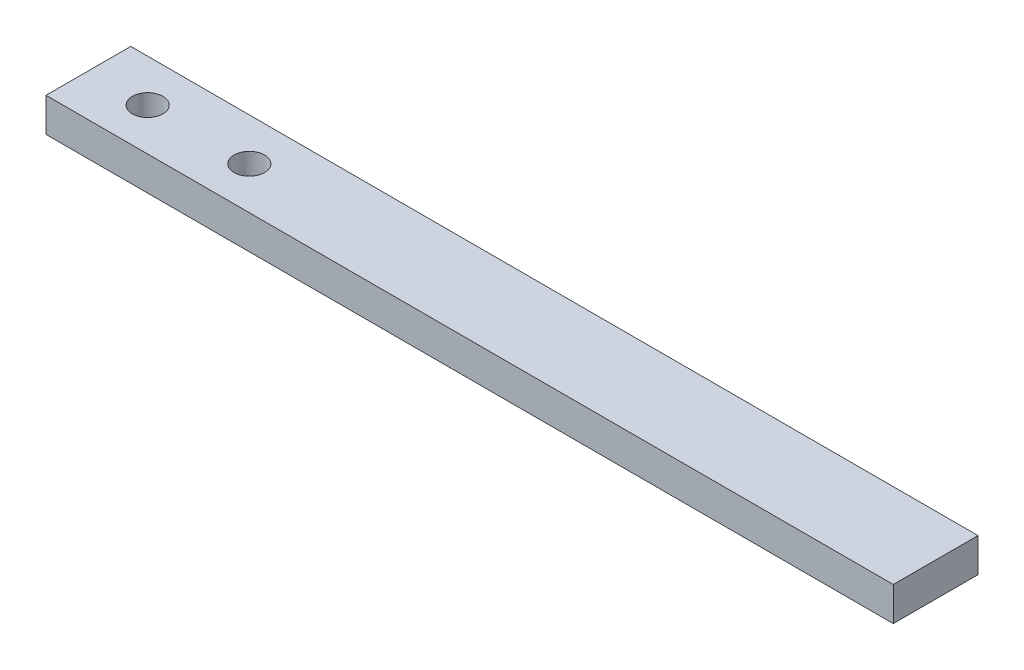
ISO-10303-21;
HEADER;
FILE_DESCRIPTION(('STEP AP214'),'2;1');
FILE_NAME('part.step','',(''),(''),'','','');
FILE_SCHEMA(('AUTOMOTIVE_DESIGN { 1 0 10303 214 1 1 1 1 }'));
ENDSEC;
DATA;
#1=APPLICATION_CONTEXT('core data for automotive mechanical design processes');
#2=APPLICATION_PROTOCOL_DEFINITION('international standard','automotive_design',2000,#1);
#3=PRODUCT_CONTEXT('',#1,'mechanical');
#4=PRODUCT('Part','Part','',(#3));
#5=PRODUCT_RELATED_PRODUCT_CATEGORY('part','',(#4));
#6=PRODUCT_DEFINITION_FORMATION('','',#4);
#7=PRODUCT_DEFINITION_CONTEXT('part definition',#1,'design');
#8=PRODUCT_DEFINITION('design','',#6,#7);
#9=PRODUCT_DEFINITION_SHAPE('','',#8);
#10=(LENGTH_UNIT() NAMED_UNIT(*) SI_UNIT(.MILLI.,.METRE.));
#11=(NAMED_UNIT(*) PLANE_ANGLE_UNIT() SI_UNIT($,.RADIAN.));
#12=(NAMED_UNIT(*) SI_UNIT($,.STERADIAN.) SOLID_ANGLE_UNIT());
#13=UNCERTAINTY_MEASURE_WITH_UNIT(LENGTH_MEASURE(1.E-05),#10,'distance_accuracy_value','');
#14=(GEOMETRIC_REPRESENTATION_CONTEXT(3) GLOBAL_UNCERTAINTY_ASSIGNED_CONTEXT((#13)) GLOBAL_UNIT_ASSIGNED_CONTEXT((#10,
#11,#12)) REPRESENTATION_CONTEXT('',''));
#15=CARTESIAN_POINT('',(0.,0.,0.));
#16=DIRECTION('',(0.,0.,1.));
#17=DIRECTION('',(1.,0.,0.));
#18=AXIS2_PLACEMENT_3D('',#15,#16,#17);
#19=CARTESIAN_POINT('',(-4.18267290292258,2.,-3.44266745497843));
#20=DIRECTION('',(1.,0.,0.));
#21=DIRECTION('',(0.,0.,-1.));
#22=AXIS2_PLACEMENT_3D('',#19,#20,#21);
#23=PLANE('',#22);
#24=DIRECTION('',(0.,0.,1.));
#25=VECTOR('',#24,1.);
#26=CARTESIAN_POINT('',(-4.18267290292258,0.,-3.44266745497843));
#27=LINE('',#26,#25);
#28=CARTESIAN_POINT('',(-4.18267290292258,0.,-3.44266745497843));
#29=VERTEX_POINT('',#28);
#30=CARTESIAN_POINT('',(-4.18267290292258,0.,1.55733254502157));
#31=VERTEX_POINT('',#30);
#32=EDGE_CURVE('E107',#29,#31,#27,.T.);
#33=ORIENTED_EDGE('',*,*,#32,.T.);
#34=DIRECTION('',(0.,-1.,0.));
#35=VECTOR('',#34,1.);
#36=CARTESIAN_POINT('',(-4.18267290292258,2.,1.55733254502157));
#37=LINE('',#36,#35);
#38=CARTESIAN_POINT('',(-4.18267290292258,2.,1.55733254502157));
#39=VERTEX_POINT('',#38);
#40=EDGE_CURVE('E11',#39,#31,#37,.T.);
#41=ORIENTED_EDGE('',*,*,#40,.F.);
#42=DIRECTION('',(0.,0.,1.));
#43=VECTOR('',#42,1.);
#44=CARTESIAN_POINT('',(-4.18267290292258,2.,-3.44266745497843));
#45=LINE('',#44,#43);
#46=CARTESIAN_POINT('',(-4.18267290292258,2.,-3.44266745497843));
#47=VERTEX_POINT('',#46);
#48=EDGE_CURVE('E89',#47,#39,#45,.T.);
#49=ORIENTED_EDGE('',*,*,#48,.F.);
#50=DIRECTION('',(0.,-1.,0.));
#51=VECTOR('',#50,1.);
#52=CARTESIAN_POINT('',(-4.18267290292258,2.,-3.44266745497843));
#53=LINE('',#52,#51);
#54=EDGE_CURVE('E56',#47,#29,#53,.T.);
#55=ORIENTED_EDGE('',*,*,#54,.T.);
#56=EDGE_LOOP('',(#33,#41,#49,#55));
#57=FACE_BOUND('',#56,.T.);
#58=ADVANCED_FACE('F39',(#57),#23,.F.);
#59=CARTESIAN_POINT('',(-4.18267290292258,2.,1.55733254502157));
#60=DIRECTION('',(0.,0.,-1.));
#61=DIRECTION('',(-1.,0.,0.));
#62=AXIS2_PLACEMENT_3D('',#59,#60,#61);
#63=PLANE('',#62);
#64=DIRECTION('',(1.,0.,0.));
#65=VECTOR('',#64,1.);
#66=CARTESIAN_POINT('',(-4.18267290292258,0.,1.55733254502157));
#67=LINE('',#66,#65);
#68=CARTESIAN_POINT('',(45.8173270970774,0.,1.55733254502157));
#69=VERTEX_POINT('',#68);
#70=EDGE_CURVE('E95',#31,#69,#67,.T.);
#71=ORIENTED_EDGE('',*,*,#70,.T.);
#72=DIRECTION('',(0.,-1.,0.));
#73=VECTOR('',#72,1.);
#74=CARTESIAN_POINT('',(45.8173270970774,2.,1.55733254502157));
#75=LINE('',#74,#73);
#76=CARTESIAN_POINT('',(45.8173270970774,2.,1.55733254502157));
#77=VERTEX_POINT('',#76);
#78=EDGE_CURVE('E48',#77,#69,#75,.T.);
#79=ORIENTED_EDGE('',*,*,#78,.F.);
#80=DIRECTION('',(1.,0.,0.));
#81=VECTOR('',#80,1.);
#82=CARTESIAN_POINT('',(-4.18267290292258,2.,1.55733254502157));
#83=LINE('',#82,#81);
#84=EDGE_CURVE('E81',#39,#77,#83,.T.);
#85=ORIENTED_EDGE('',*,*,#84,.F.);
#86=ORIENTED_EDGE('',*,*,#40,.T.);
#87=EDGE_LOOP('',(#71,#79,#85,#86));
#88=FACE_BOUND('',#87,.T.);
#89=ADVANCED_FACE('F94',(#88),#63,.F.);
#90=CARTESIAN_POINT('',(45.8173270970774,2.,-3.44266745497843));
#91=DIRECTION('',(1.,0.,0.));
#92=DIRECTION('',(0.,0.,-1.));
#93=AXIS2_PLACEMENT_3D('',#90,#91,#92);
#94=PLANE('',#93);
#95=DIRECTION('',(0.,0.,1.));
#96=VECTOR('',#95,1.);
#97=CARTESIAN_POINT('',(45.8173270970774,0.,-3.44266745497843));
#98=LINE('',#97,#96);
#99=CARTESIAN_POINT('',(45.8173270970774,0.,-3.44266745497843));
#100=VERTEX_POINT('',#99);
#101=EDGE_CURVE('E113',#100,#69,#98,.T.);
#102=ORIENTED_EDGE('',*,*,#101,.F.);
#103=DIRECTION('',(0.,-1.,0.));
#104=VECTOR('',#103,1.);
#105=CARTESIAN_POINT('',(45.8173270970774,2.,-3.44266745497843));
#106=LINE('',#105,#104);
#107=CARTESIAN_POINT('',(45.8173270970774,2.,-3.44266745497843));
#108=VERTEX_POINT('',#107);
#109=EDGE_CURVE('E70',#108,#100,#106,.T.);
#110=ORIENTED_EDGE('',*,*,#109,.F.);
#111=DIRECTION('',(0.,0.,1.));
#112=VECTOR('',#111,1.);
#113=CARTESIAN_POINT('',(45.8173270970774,2.,-3.44266745497843));
#114=LINE('',#113,#112);
#115=EDGE_CURVE('E88',#108,#77,#114,.T.);
#116=ORIENTED_EDGE('',*,*,#115,.T.);
#117=ORIENTED_EDGE('',*,*,#78,.T.);
#118=EDGE_LOOP('',(#102,#110,#116,#117));
#119=FACE_BOUND('',#118,.T.);
#120=ADVANCED_FACE('F99',(#119),#94,.T.);
#121=CARTESIAN_POINT('',(-4.18267290292258,2.,-3.44266745497843));
#122=DIRECTION('',(0.,0.,-1.));
#123=DIRECTION('',(-1.,0.,0.));
#124=AXIS2_PLACEMENT_3D('',#121,#122,#123);
#125=PLANE('',#124);
#126=DIRECTION('',(1.,0.,0.));
#127=VECTOR('',#126,1.);
#128=CARTESIAN_POINT('',(-4.18267290292258,0.,-3.44266745497843));
#129=LINE('',#128,#127);
#130=EDGE_CURVE('E116',#29,#100,#129,.T.);
#131=ORIENTED_EDGE('',*,*,#130,.F.);
#132=ORIENTED_EDGE('',*,*,#54,.F.);
#133=DIRECTION('',(1.,0.,0.));
#134=VECTOR('',#133,1.);
#135=CARTESIAN_POINT('',(-4.18267290292258,2.,-3.44266745497843));
#136=LINE('',#135,#134);
#137=EDGE_CURVE('E101',#47,#108,#136,.T.);
#138=ORIENTED_EDGE('',*,*,#137,.T.);
#139=ORIENTED_EDGE('',*,*,#109,.T.);
#140=EDGE_LOOP('',(#131,#132,#138,#139));
#141=FACE_BOUND('',#140,.T.);
#142=ADVANCED_FACE('F154',(#141),#125,.T.);
#143=CARTESIAN_POINT('',(0.,2.,0.));
#144=DIRECTION('',(0.,1.,0.));
#145=DIRECTION('',(0.,0.,1.));
#146=AXIS2_PLACEMENT_3D('',#143,#144,#145);
#147=PLANE('',#146);
#148=CARTESIAN_POINT('',(5.31732709707742,2.,-0.942667454978434));
#149=DIRECTION('',(0.,1.,0.));
#150=DIRECTION('',(0.,0.,1.));
#151=AXIS2_PLACEMENT_3D('',#148,#149,#150);
#152=CIRCLE('',#151,0.899999999999999);
#153=CARTESIAN_POINT('',(5.31732709707742,2.,-0.0426674549784347));
#154=VERTEX_POINT('',#153);
#155=EDGE_CURVE('E134',#154,#154,#152,.T.);
#156=ORIENTED_EDGE('',*,*,#155,.F.);
#157=EDGE_LOOP('',(#156));
#158=FACE_BOUND('',#157,.T.);
#159=CARTESIAN_POINT('',(-0.682672902922581,2.,-0.942667454978434));
#160=DIRECTION('',(0.,1.,0.));
#161=DIRECTION('',(0.,0.,1.));
#162=AXIS2_PLACEMENT_3D('',#159,#160,#161);
#163=CIRCLE('',#162,0.9);
#164=CARTESIAN_POINT('',(-0.682672902922581,2.,-0.0426674549784342));
#165=VERTEX_POINT('',#164);
#166=EDGE_CURVE('E126',#165,#165,#163,.T.);
#167=ORIENTED_EDGE('',*,*,#166,.F.);
#168=EDGE_LOOP('',(#167));
#169=FACE_BOUND('',#168,.T.);
#170=ORIENTED_EDGE('',*,*,#48,.T.);
#171=ORIENTED_EDGE('',*,*,#84,.T.);
#172=ORIENTED_EDGE('',*,*,#115,.F.);
#173=ORIENTED_EDGE('',*,*,#137,.F.);
#174=EDGE_LOOP('',(#170,#171,#172,#173));
#175=FACE_BOUND('',#174,.T.);
#176=ADVANCED_FACE('F85',(#158,#169,#175),#147,.T.);
#177=CARTESIAN_POINT('',(0.,0.,0.));
#178=DIRECTION('',(0.,1.,0.));
#179=DIRECTION('',(0.,0.,1.));
#180=AXIS2_PLACEMENT_3D('',#177,#178,#179);
#181=PLANE('',#180);
#182=CARTESIAN_POINT('',(5.31732709707742,0.,-0.942667454978434));
#183=DIRECTION('',(0.,1.,0.));
#184=DIRECTION('',(0.,0.,1.));
#185=AXIS2_PLACEMENT_3D('',#182,#183,#184);
#186=CIRCLE('',#185,0.899999999999999);
#187=CARTESIAN_POINT('',(5.31732709707742,0.,-0.0426674549784347));
#188=VERTEX_POINT('',#187);
#189=EDGE_CURVE('E110',#188,#188,#186,.T.);
#190=ORIENTED_EDGE('',*,*,#189,.T.);
#191=EDGE_LOOP('',(#190));
#192=FACE_BOUND('',#191,.T.);
#193=CARTESIAN_POINT('',(-0.682672902922581,0.,-0.942667454978434));
#194=DIRECTION('',(0.,1.,0.));
#195=DIRECTION('',(0.,0.,1.));
#196=AXIS2_PLACEMENT_3D('',#193,#194,#195);
#197=CIRCLE('',#196,0.9);
#198=CARTESIAN_POINT('',(-0.682672902922581,0.,-0.0426674549784342));
#199=VERTEX_POINT('',#198);
#200=EDGE_CURVE('E130',#199,#199,#197,.T.);
#201=ORIENTED_EDGE('',*,*,#200,.T.);
#202=EDGE_LOOP('',(#201));
#203=FACE_BOUND('',#202,.T.);
#204=ORIENTED_EDGE('',*,*,#32,.F.);
#205=ORIENTED_EDGE('',*,*,#130,.T.);
#206=ORIENTED_EDGE('',*,*,#101,.T.);
#207=ORIENTED_EDGE('',*,*,#70,.F.);
#208=EDGE_LOOP('',(#204,#205,#206,#207));
#209=FACE_BOUND('',#208,.T.);
#210=ADVANCED_FACE('F142',(#192,#203,#209),#181,.F.);
#211=CARTESIAN_POINT('',(-0.682672902922581,0.,-0.942667454978434));
#212=DIRECTION('',(0.,1.,0.));
#213=DIRECTION('',(0.,0.,1.));
#214=AXIS2_PLACEMENT_3D('',#211,#212,#213);
#215=CYLINDRICAL_SURFACE('',#214,0.9);
#216=ORIENTED_EDGE('',*,*,#200,.F.);
#217=EDGE_LOOP('',(#216));
#218=FACE_BOUND('',#217,.T.);
#219=ORIENTED_EDGE('',*,*,#166,.T.);
#220=EDGE_LOOP('',(#219));
#221=FACE_BOUND('',#220,.T.);
#222=ADVANCED_FACE('F148',(#218,#221),#215,.F.);
#223=CARTESIAN_POINT('',(5.31732709707742,0.,-0.942667454978434));
#224=DIRECTION('',(0.,1.,0.));
#225=DIRECTION('',(0.,0.,1.));
#226=AXIS2_PLACEMENT_3D('',#223,#224,#225);
#227=CYLINDRICAL_SURFACE('',#226,0.899999999999999);
#228=ORIENTED_EDGE('',*,*,#189,.F.);
#229=EDGE_LOOP('',(#228));
#230=FACE_BOUND('',#229,.T.);
#231=ORIENTED_EDGE('',*,*,#155,.T.);
#232=EDGE_LOOP('',(#231));
#233=FACE_BOUND('',#232,.T.);
#234=ADVANCED_FACE('F145',(#230,#233),#227,.F.);
#235=CLOSED_SHELL('',(#58,#89,#120,#142,#176,#210,#222,#234));
#236=MANIFOLD_SOLID_BREP('B2',#235);
#237=ADVANCED_BREP_SHAPE_REPRESENTATION('',(#18,#236),#14);
#238=SHAPE_DEFINITION_REPRESENTATION(#9,#237);
ENDSEC;
END-ISO-10303-21;
